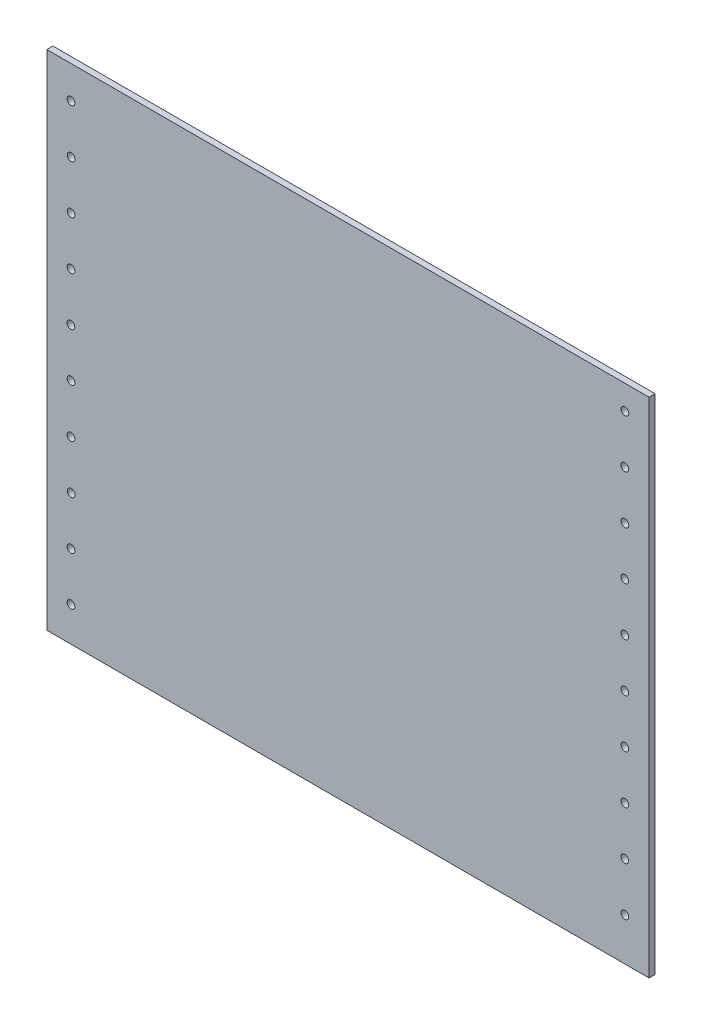
ISO-10303-21;
HEADER;
FILE_DESCRIPTION(('STEP AP214'),'2;1');
FILE_NAME('part.step','',(''),(''),'','','');
FILE_SCHEMA(('AUTOMOTIVE_DESIGN { 1 0 10303 214 1 1 1 1 }'));
ENDSEC;
DATA;
#1=APPLICATION_CONTEXT('core data for automotive mechanical design processes');
#2=APPLICATION_PROTOCOL_DEFINITION('international standard','automotive_design',2000,#1);
#3=PRODUCT_CONTEXT('',#1,'mechanical');
#4=PRODUCT('Part','Part','',(#3));
#5=PRODUCT_RELATED_PRODUCT_CATEGORY('part','',(#4));
#6=PRODUCT_DEFINITION_FORMATION('','',#4);
#7=PRODUCT_DEFINITION_CONTEXT('part definition',#1,'design');
#8=PRODUCT_DEFINITION('design','',#6,#7);
#9=PRODUCT_DEFINITION_SHAPE('','',#8);
#10=(LENGTH_UNIT() NAMED_UNIT(*) SI_UNIT(.MILLI.,.METRE.));
#11=(NAMED_UNIT(*) PLANE_ANGLE_UNIT() SI_UNIT($,.RADIAN.));
#12=(NAMED_UNIT(*) SI_UNIT($,.STERADIAN.) SOLID_ANGLE_UNIT());
#13=UNCERTAINTY_MEASURE_WITH_UNIT(LENGTH_MEASURE(1.E-05),#10,'distance_accuracy_value','');
#14=(GEOMETRIC_REPRESENTATION_CONTEXT(3) GLOBAL_UNCERTAINTY_ASSIGNED_CONTEXT((#13)) GLOBAL_UNIT_ASSIGNED_CONTEXT((#10,
#11,#12)) REPRESENTATION_CONTEXT('',''));
#15=CARTESIAN_POINT('',(0.,0.,0.));
#16=DIRECTION('',(0.,0.,1.));
#17=DIRECTION('',(1.,0.,0.));
#18=AXIS2_PLACEMENT_3D('',#15,#16,#17);
#19=CARTESIAN_POINT('',(0.,0.,3.175));
#20=DIRECTION('',(-1.,0.,0.));
#21=DIRECTION('',(0.,-1.,0.));
#22=AXIS2_PLACEMENT_3D('',#19,#20,#21);
#23=PLANE('',#22);
#24=DIRECTION('',(0.,1.,0.));
#25=VECTOR('',#24,1.);
#26=CARTESIAN_POINT('',(0.,0.,0.));
#27=LINE('',#26,#25);
#28=CARTESIAN_POINT('',(0.,0.,0.));
#29=VERTEX_POINT('',#28);
#30=CARTESIAN_POINT('',(0.,263.652,0.));
#31=VERTEX_POINT('',#30);
#32=EDGE_CURVE('E167',#29,#31,#27,.T.);
#33=ORIENTED_EDGE('',*,*,#32,.T.);
#34=DIRECTION('',(0.,0.,-1.));
#35=VECTOR('',#34,1.);
#36=CARTESIAN_POINT('',(0.,263.652,3.175));
#37=LINE('',#36,#35);
#38=CARTESIAN_POINT('',(0.,263.652,3.175));
#39=VERTEX_POINT('',#38);
#40=EDGE_CURVE('E11',#39,#31,#37,.T.);
#41=ORIENTED_EDGE('',*,*,#40,.F.);
#42=DIRECTION('',(0.,1.,0.));
#43=VECTOR('',#42,1.);
#44=CARTESIAN_POINT('',(0.,0.,3.175));
#45=LINE('',#44,#43);
#46=CARTESIAN_POINT('',(0.,0.,3.175));
#47=VERTEX_POINT('',#46);
#48=EDGE_CURVE('E85',#47,#39,#45,.T.);
#49=ORIENTED_EDGE('',*,*,#48,.F.);
#50=DIRECTION('',(0.,0.,-1.));
#51=VECTOR('',#50,1.);
#52=CARTESIAN_POINT('',(0.,0.,3.175));
#53=LINE('',#52,#51);
#54=EDGE_CURVE('E46',#47,#29,#53,.T.);
#55=ORIENTED_EDGE('',*,*,#54,.T.);
#56=EDGE_LOOP('',(#33,#41,#49,#55));
#57=FACE_BOUND('',#56,.T.);
#58=ADVANCED_FACE('F38',(#57),#23,.F.);
#59=CARTESIAN_POINT('',(0.,263.652,3.175));
#60=DIRECTION('',(0.,-1.,0.));
#61=DIRECTION('',(1.,0.,0.));
#62=AXIS2_PLACEMENT_3D('',#59,#60,#61);
#63=PLANE('',#62);
#64=DIRECTION('',(-1.,0.,0.));
#65=VECTOR('',#64,1.);
#66=CARTESIAN_POINT('',(0.,263.652,0.));
#67=LINE('',#66,#65);
#68=CARTESIAN_POINT('',(-315.722,263.652,0.));
#69=VERTEX_POINT('',#68);
#70=EDGE_CURVE('E66',#31,#69,#67,.T.);
#71=ORIENTED_EDGE('',*,*,#70,.T.);
#72=DIRECTION('',(0.,0.,-1.));
#73=VECTOR('',#72,1.);
#74=CARTESIAN_POINT('',(-315.722,263.652,3.175));
#75=LINE('',#74,#73);
#76=CARTESIAN_POINT('',(-315.722,263.652,3.175));
#77=VERTEX_POINT('',#76);
#78=EDGE_CURVE('E90',#77,#69,#75,.T.);
#79=ORIENTED_EDGE('',*,*,#78,.F.);
#80=DIRECTION('',(-1.,0.,0.));
#81=VECTOR('',#80,1.);
#82=CARTESIAN_POINT('',(0.,263.652,3.175));
#83=LINE('',#82,#81);
#84=EDGE_CURVE('E79',#39,#77,#83,.T.);
#85=ORIENTED_EDGE('',*,*,#84,.F.);
#86=ORIENTED_EDGE('',*,*,#40,.T.);
#87=EDGE_LOOP('',(#71,#79,#85,#86));
#88=FACE_BOUND('',#87,.T.);
#89=ADVANCED_FACE('F91',(#88),#63,.F.);
#90=CARTESIAN_POINT('',(0.,0.,3.175));
#91=DIRECTION('',(0.,1.,0.));
#92=DIRECTION('',(0.,0.,1.));
#93=AXIS2_PLACEMENT_3D('',#90,#91,#92);
#94=PLANE('',#93);
#95=DIRECTION('',(1.,0.,0.));
#96=VECTOR('',#95,1.);
#97=CARTESIAN_POINT('',(0.,0.,0.));
#98=LINE('',#97,#96);
#99=CARTESIAN_POINT('',(-315.722,0.,0.));
#100=VERTEX_POINT('',#99);
#101=EDGE_CURVE('E168',#100,#29,#98,.T.);
#102=ORIENTED_EDGE('',*,*,#101,.T.);
#103=ORIENTED_EDGE('',*,*,#54,.F.);
#104=DIRECTION('',(1.,0.,0.));
#105=VECTOR('',#104,1.);
#106=CARTESIAN_POINT('',(0.,0.,3.175));
#107=LINE('',#106,#105);
#108=CARTESIAN_POINT('',(-315.722,0.,3.175));
#109=VERTEX_POINT('',#108);
#110=EDGE_CURVE('E54',#109,#47,#107,.T.);
#111=ORIENTED_EDGE('',*,*,#110,.F.);
#112=DIRECTION('',(0.,0.,1.));
#113=VECTOR('',#112,1.);
#114=CARTESIAN_POINT('',(-315.722,0.,3.175));
#115=LINE('',#114,#113);
#116=EDGE_CURVE('E97',#100,#109,#115,.T.);
#117=ORIENTED_EDGE('',*,*,#116,.F.);
#118=EDGE_LOOP('',(#102,#103,#111,#117));
#119=FACE_BOUND('',#118,.T.);
#120=ADVANCED_FACE('F177',(#119),#94,.F.);
#121=CARTESIAN_POINT('',(0.,0.,3.175));
#122=DIRECTION('',(0.,0.,1.));
#123=DIRECTION('',(1.,0.,0.));
#124=AXIS2_PLACEMENT_3D('',#121,#122,#123);
#125=PLANE('',#124);
#126=CARTESIAN_POINT('',(-303.038466385573,18.0373055032867,3.175));
#127=DIRECTION('',(0.,0.,1.));
#128=DIRECTION('',(1.,0.,0.));
#129=AXIS2_PLACEMENT_3D('',#126,#127,#128);
#130=CIRCLE('',#129,2.03199999999998);
#131=CARTESIAN_POINT('',(-301.006466385573,18.0373055032867,3.175));
#132=VERTEX_POINT('',#131);
#133=EDGE_CURVE('E491',#132,#132,#130,.T.);
#134=ORIENTED_EDGE('',*,*,#133,.F.);
#135=EDGE_LOOP('',(#134));
#136=FACE_BOUND('',#135,.T.);
#137=CARTESIAN_POINT('',(-303.038466385573,43.3528052156548,3.175));
#138=DIRECTION('',(0.,0.,1.));
#139=DIRECTION('',(1.,0.,0.));
#140=AXIS2_PLACEMENT_3D('',#137,#138,#139);
#141=CIRCLE('',#140,2.03199999999998);
#142=CARTESIAN_POINT('',(-301.006466385573,43.3528052156548,3.175));
#143=VERTEX_POINT('',#142);
#144=EDGE_CURVE('E501',#143,#143,#141,.T.);
#145=ORIENTED_EDGE('',*,*,#144,.F.);
#146=EDGE_LOOP('',(#145));
#147=FACE_BOUND('',#146,.T.);
#148=CARTESIAN_POINT('',(-302.942209732675,68.7645615809216,3.175));
#149=DIRECTION('',(0.,0.,1.));
#150=DIRECTION('',(1.,0.,0.));
#151=AXIS2_PLACEMENT_3D('',#148,#149,#150);
#152=CIRCLE('',#151,2.03199999999998);
#153=CARTESIAN_POINT('',(-300.910209732675,68.7645615809216,3.175));
#154=VERTEX_POINT('',#153);
#155=EDGE_CURVE('E507',#154,#154,#152,.T.);
#156=ORIENTED_EDGE('',*,*,#155,.F.);
#157=EDGE_LOOP('',(#156));
#158=FACE_BOUND('',#157,.T.);
#159=CARTESIAN_POINT('',(-303.05272795072,94.1648563366108,3.175));
#160=DIRECTION('',(0.,0.,1.));
#161=DIRECTION('',(1.,0.,0.));
#162=AXIS2_PLACEMENT_3D('',#159,#160,#161);
#163=CIRCLE('',#162,2.03199999999998);
#164=CARTESIAN_POINT('',(-301.02072795072,94.1648563366108,3.175));
#165=VERTEX_POINT('',#164);
#166=EDGE_CURVE('E513',#165,#165,#163,.T.);
#167=ORIENTED_EDGE('',*,*,#166,.F.);
#168=EDGE_LOOP('',(#167));
#169=FACE_BOUND('',#168,.T.);
#170=CARTESIAN_POINT('',(-303.052670579792,119.665156537544,3.175));
#171=DIRECTION('',(0.,0.,1.));
#172=DIRECTION('',(1.,0.,0.));
#173=AXIS2_PLACEMENT_3D('',#170,#171,#172);
#174=CIRCLE('',#173,2.03199999999998);
#175=CARTESIAN_POINT('',(-301.020670579792,119.665156537544,3.175));
#176=VERTEX_POINT('',#175);
#177=EDGE_CURVE('E519',#176,#176,#174,.T.);
#178=ORIENTED_EDGE('',*,*,#177,.F.);
#179=EDGE_LOOP('',(#178));
#180=FACE_BOUND('',#179,.T.);
#181=CARTESIAN_POINT('',(-303.108229879035,144.967881351292,3.175));
#182=DIRECTION('',(0.,0.,1.));
#183=DIRECTION('',(1.,0.,0.));
#184=AXIS2_PLACEMENT_3D('',#181,#182,#183);
#185=CIRCLE('',#184,2.03199999999998);
#186=CARTESIAN_POINT('',(-301.076229879035,144.967881351292,3.175));
#187=VERTEX_POINT('',#186);
#188=EDGE_CURVE('E525',#187,#187,#185,.T.);
#189=ORIENTED_EDGE('',*,*,#188,.F.);
#190=EDGE_LOOP('',(#189));
#191=FACE_BOUND('',#190,.T.);
#192=CARTESIAN_POINT('',(-303.035806047783,170.388646120707,3.175));
#193=DIRECTION('',(0.,0.,1.));
#194=DIRECTION('',(1.,0.,0.));
#195=AXIS2_PLACEMENT_3D('',#192,#193,#194);
#196=CIRCLE('',#195,2.03199999999998);
#197=CARTESIAN_POINT('',(-301.003806047783,170.388646120707,3.175));
#198=VERTEX_POINT('',#197);
#199=EDGE_CURVE('E531',#198,#198,#196,.T.);
#200=ORIENTED_EDGE('',*,*,#199,.F.);
#201=EDGE_LOOP('',(#200));
#202=FACE_BOUND('',#201,.T.);
#203=CARTESIAN_POINT('',(-302.996197919569,195.793009034226,3.175));
#204=DIRECTION('',(0.,0.,1.));
#205=DIRECTION('',(1.,0.,0.));
#206=AXIS2_PLACEMENT_3D('',#203,#204,#205);
#207=CIRCLE('',#206,2.03199999999998);
#208=CARTESIAN_POINT('',(-300.964197919569,195.793009034226,3.175));
#209=VERTEX_POINT('',#208);
#210=EDGE_CURVE('E537',#209,#209,#207,.T.);
#211=ORIENTED_EDGE('',*,*,#210,.F.);
#212=EDGE_LOOP('',(#211));
#213=FACE_BOUND('',#212,.T.);
#214=CARTESIAN_POINT('',(-302.934584274532,221.174726269806,3.175));
#215=DIRECTION('',(0.,0.,-1.));
#216=DIRECTION('',(-1.,0.,0.));
#217=AXIS2_PLACEMENT_3D('',#214,#215,#216);
#218=CIRCLE('',#217,2.03199999999998);
#219=CARTESIAN_POINT('',(-304.966584274532,221.174726269806,3.175));
#220=VERTEX_POINT('',#219);
#221=EDGE_CURVE('E541',#220,#220,#218,.T.);
#222=ORIENTED_EDGE('',*,*,#221,.T.);
#223=EDGE_LOOP('',(#222));
#224=FACE_BOUND('',#223,.T.);
#225=CARTESIAN_POINT('',(-303.045770192667,246.632047516111,3.175));
#226=DIRECTION('',(0.,0.,-1.));
#227=DIRECTION('',(-1.,0.,0.));
#228=AXIS2_PLACEMENT_3D('',#225,#226,#227);
#229=CIRCLE('',#228,2.03199999999995);
#230=CARTESIAN_POINT('',(-305.077770192667,246.632047516111,3.175));
#231=VERTEX_POINT('',#230);
#232=EDGE_CURVE('E98',#231,#231,#229,.T.);
#233=ORIENTED_EDGE('',*,*,#232,.T.);
#234=EDGE_LOOP('',(#233));
#235=FACE_BOUND('',#234,.T.);
#236=CARTESIAN_POINT('',(-12.7224981537028,22.305646157761,3.175));
#237=DIRECTION('',(0.,0.,-1.));
#238=DIRECTION('',(-1.,0.,0.));
#239=AXIS2_PLACEMENT_3D('',#236,#237,#238);
#240=CIRCLE('',#239,2.032);
#241=CARTESIAN_POINT('',(-14.7544981537028,22.305646157761,3.175));
#242=VERTEX_POINT('',#241);
#243=EDGE_CURVE('E108',#242,#242,#240,.T.);
#244=ORIENTED_EDGE('',*,*,#243,.T.);
#245=EDGE_LOOP('',(#244));
#246=FACE_BOUND('',#245,.T.);
#247=CARTESIAN_POINT('',(-12.7709550150925,47.7319932301895,3.175));
#248=DIRECTION('',(0.,0.,-1.));
#249=DIRECTION('',(-1.,0.,0.));
#250=AXIS2_PLACEMENT_3D('',#247,#248,#249);
#251=CIRCLE('',#250,2.032);
#252=CARTESIAN_POINT('',(-14.8029550150925,47.7319932301895,3.175));
#253=VERTEX_POINT('',#252);
#254=EDGE_CURVE('E114',#253,#253,#251,.T.);
#255=ORIENTED_EDGE('',*,*,#254,.T.);
#256=EDGE_LOOP('',(#255));
#257=FACE_BOUND('',#256,.T.);
#258=CARTESIAN_POINT('',(-12.6985919711104,73.0799787157432,3.175));
#259=DIRECTION('',(0.,0.,-1.));
#260=DIRECTION('',(-1.,0.,0.));
#261=AXIS2_PLACEMENT_3D('',#258,#259,#260);
#262=CIRCLE('',#261,2.032);
#263=CARTESIAN_POINT('',(-14.7305919711104,73.0799787157432,3.175));
#264=VERTEX_POINT('',#263);
#265=EDGE_CURVE('E120',#264,#264,#262,.T.);
#266=ORIENTED_EDGE('',*,*,#265,.T.);
#267=EDGE_LOOP('',(#266));
#268=FACE_BOUND('',#267,.T.);
#269=CARTESIAN_POINT('',(-12.715870449112,98.5406440684166,3.175));
#270=DIRECTION('',(0.,0.,-1.));
#271=DIRECTION('',(-1.,0.,0.));
#272=AXIS2_PLACEMENT_3D('',#269,#270,#271);
#273=CIRCLE('',#272,2.032);
#274=CARTESIAN_POINT('',(-14.747870449112,98.5406440684166,3.175));
#275=VERTEX_POINT('',#274);
#276=EDGE_CURVE('E126',#275,#275,#273,.T.);
#277=ORIENTED_EDGE('',*,*,#276,.T.);
#278=EDGE_LOOP('',(#277));
#279=FACE_BOUND('',#278,.T.);
#280=CARTESIAN_POINT('',(-12.7312605211184,123.951956593345,3.175));
#281=DIRECTION('',(0.,0.,-1.));
#282=DIRECTION('',(-1.,0.,0.));
#283=AXIS2_PLACEMENT_3D('',#280,#281,#282);
#284=CIRCLE('',#283,2.032);
#285=CARTESIAN_POINT('',(-14.7632605211184,123.951956593345,3.175));
#286=VERTEX_POINT('',#285);
#287=EDGE_CURVE('E132',#286,#286,#284,.T.);
#288=ORIENTED_EDGE('',*,*,#287,.T.);
#289=EDGE_LOOP('',(#288));
#290=FACE_BOUND('',#289,.T.);
#291=CARTESIAN_POINT('',(-12.7060036534914,149.340547347492,3.175));
#292=DIRECTION('',(0.,0.,-1.));
#293=DIRECTION('',(-1.,0.,0.));
#294=AXIS2_PLACEMENT_3D('',#291,#292,#293);
#295=CIRCLE('',#294,2.032);
#296=CARTESIAN_POINT('',(-14.7380036534914,149.340547347492,3.175));
#297=VERTEX_POINT('',#296);
#298=EDGE_CURVE('E138',#297,#297,#295,.T.);
#299=ORIENTED_EDGE('',*,*,#298,.T.);
#300=EDGE_LOOP('',(#299));
#301=FACE_BOUND('',#300,.T.);
#302=CARTESIAN_POINT('',(-12.7383117328772,174.751351443042,3.175));
#303=DIRECTION('',(0.,0.,-1.));
#304=DIRECTION('',(-1.,0.,0.));
#305=AXIS2_PLACEMENT_3D('',#302,#303,#304);
#306=CIRCLE('',#305,2.032);
#307=CARTESIAN_POINT('',(-14.7703117328772,174.751351443042,3.175));
#308=VERTEX_POINT('',#307);
#309=EDGE_CURVE('E144',#308,#308,#306,.T.);
#310=ORIENTED_EDGE('',*,*,#309,.T.);
#311=EDGE_LOOP('',(#310));
#312=FACE_BOUND('',#311,.T.);
#313=CARTESIAN_POINT('',(-12.6975027770239,200.153488855026,3.175));
#314=DIRECTION('',(0.,0.,-1.));
#315=DIRECTION('',(-1.,0.,0.));
#316=AXIS2_PLACEMENT_3D('',#313,#314,#315);
#317=CIRCLE('',#316,2.032);
#318=CARTESIAN_POINT('',(-14.7295027770239,200.153488855026,3.175));
#319=VERTEX_POINT('',#318);
#320=EDGE_CURVE('E150',#319,#319,#317,.T.);
#321=ORIENTED_EDGE('',*,*,#320,.T.);
#322=EDGE_LOOP('',(#321));
#323=FACE_BOUND('',#322,.T.);
#324=CARTESIAN_POINT('',(-12.748360271577,225.521736015788,3.175));
#325=DIRECTION('',(0.,0.,-1.));
#326=DIRECTION('',(-1.,0.,0.));
#327=AXIS2_PLACEMENT_3D('',#324,#325,#326);
#328=CIRCLE('',#327,2.032);
#329=CARTESIAN_POINT('',(-14.780360271577,225.521736015788,3.175));
#330=VERTEX_POINT('',#329);
#331=EDGE_CURVE('E156',#330,#330,#328,.T.);
#332=ORIENTED_EDGE('',*,*,#331,.T.);
#333=EDGE_LOOP('',(#332));
#334=FACE_BOUND('',#333,.T.);
#335=CARTESIAN_POINT('',(-12.7,250.952,3.175));
#336=DIRECTION('',(0.,0.,1.));
#337=DIRECTION('',(1.,0.,0.));
#338=AXIS2_PLACEMENT_3D('',#335,#336,#337);
#339=CIRCLE('',#338,2.03200000000001);
#340=CARTESIAN_POINT('',(-10.668,250.952,3.175));
#341=VERTEX_POINT('',#340);
#342=EDGE_CURVE('E159',#341,#341,#339,.T.);
#343=ORIENTED_EDGE('',*,*,#342,.F.);
#344=EDGE_LOOP('',(#343));
#345=FACE_BOUND('',#344,.T.);
#346=ORIENTED_EDGE('',*,*,#48,.T.);
#347=ORIENTED_EDGE('',*,*,#84,.T.);
#348=DIRECTION('',(0.,1.,0.));
#349=VECTOR('',#348,1.);
#350=CARTESIAN_POINT('',(-315.722,0.,3.175));
#351=LINE('',#350,#349);
#352=EDGE_CURVE('E83',#109,#77,#351,.T.);
#353=ORIENTED_EDGE('',*,*,#352,.F.);
#354=ORIENTED_EDGE('',*,*,#110,.T.);
#355=EDGE_LOOP('',(#346,#347,#353,#354));
#356=FACE_BOUND('',#355,.T.);
#357=ADVANCED_FACE('F81',(#136,#147,#158,#169,#180,#191,#202,#213,#224,#235,#246,#257,#268,#279,
#290,#301,#312,#323,#334,#345,#356),#125,.T.);
#358=CARTESIAN_POINT('',(0.,0.,0.));
#359=DIRECTION('',(0.,0.,1.));
#360=DIRECTION('',(1.,0.,0.));
#361=AXIS2_PLACEMENT_3D('',#358,#359,#360);
#362=PLANE('',#361);
#363=CARTESIAN_POINT('',(-303.038466385573,18.0373055032867,0.));
#364=DIRECTION('',(0.,0.,-1.));
#365=DIRECTION('',(-1.,0.,0.));
#366=AXIS2_PLACEMENT_3D('',#363,#364,#365);
#367=CIRCLE('',#366,2.03199999999998);
#368=CARTESIAN_POINT('',(-305.070466385573,18.0373055032867,0.));
#369=VERTEX_POINT('',#368);
#370=EDGE_CURVE('E494',#369,#369,#367,.T.);
#371=ORIENTED_EDGE('',*,*,#370,.F.);
#372=EDGE_LOOP('',(#371));
#373=FACE_BOUND('',#372,.T.);
#374=CARTESIAN_POINT('',(-303.038466385573,43.3528052156548,0.));
#375=DIRECTION('',(0.,0.,-1.));
#376=DIRECTION('',(-1.,0.,0.));
#377=AXIS2_PLACEMENT_3D('',#374,#375,#376);
#378=CIRCLE('',#377,2.03199999999998);
#379=CARTESIAN_POINT('',(-305.070466385573,43.3528052156548,0.));
#380=VERTEX_POINT('',#379);
#381=EDGE_CURVE('E496',#380,#380,#378,.T.);
#382=ORIENTED_EDGE('',*,*,#381,.F.);
#383=EDGE_LOOP('',(#382));
#384=FACE_BOUND('',#383,.T.);
#385=CARTESIAN_POINT('',(-302.942209732675,68.7645615809216,0.));
#386=DIRECTION('',(0.,0.,-1.));
#387=DIRECTION('',(-1.,0.,0.));
#388=AXIS2_PLACEMENT_3D('',#385,#386,#387);
#389=CIRCLE('',#388,2.03199999999998);
#390=CARTESIAN_POINT('',(-304.974209732675,68.7645615809216,0.));
#391=VERTEX_POINT('',#390);
#392=EDGE_CURVE('E504',#391,#391,#389,.T.);
#393=ORIENTED_EDGE('',*,*,#392,.F.);
#394=EDGE_LOOP('',(#393));
#395=FACE_BOUND('',#394,.T.);
#396=CARTESIAN_POINT('',(-303.05272795072,94.1648563366108,0.));
#397=DIRECTION('',(0.,0.,-1.));
#398=DIRECTION('',(-1.,0.,0.));
#399=AXIS2_PLACEMENT_3D('',#396,#397,#398);
#400=CIRCLE('',#399,2.03199999999998);
#401=CARTESIAN_POINT('',(-305.08472795072,94.1648563366108,0.));
#402=VERTEX_POINT('',#401);
#403=EDGE_CURVE('E510',#402,#402,#400,.T.);
#404=ORIENTED_EDGE('',*,*,#403,.F.);
#405=EDGE_LOOP('',(#404));
#406=FACE_BOUND('',#405,.T.);
#407=CARTESIAN_POINT('',(-303.052670579792,119.665156537544,0.));
#408=DIRECTION('',(0.,0.,-1.));
#409=DIRECTION('',(-1.,0.,0.));
#410=AXIS2_PLACEMENT_3D('',#407,#408,#409);
#411=CIRCLE('',#410,2.03199999999998);
#412=CARTESIAN_POINT('',(-305.084670579792,119.665156537544,0.));
#413=VERTEX_POINT('',#412);
#414=EDGE_CURVE('E516',#413,#413,#411,.T.);
#415=ORIENTED_EDGE('',*,*,#414,.F.);
#416=EDGE_LOOP('',(#415));
#417=FACE_BOUND('',#416,.T.);
#418=CARTESIAN_POINT('',(-303.108229879035,144.967881351292,0.));
#419=DIRECTION('',(0.,0.,-1.));
#420=DIRECTION('',(-1.,0.,0.));
#421=AXIS2_PLACEMENT_3D('',#418,#419,#420);
#422=CIRCLE('',#421,2.03199999999998);
#423=CARTESIAN_POINT('',(-305.140229879035,144.967881351292,0.));
#424=VERTEX_POINT('',#423);
#425=EDGE_CURVE('E522',#424,#424,#422,.T.);
#426=ORIENTED_EDGE('',*,*,#425,.F.);
#427=EDGE_LOOP('',(#426));
#428=FACE_BOUND('',#427,.T.);
#429=CARTESIAN_POINT('',(-303.035806047783,170.388646120707,0.));
#430=DIRECTION('',(0.,0.,-1.));
#431=DIRECTION('',(-1.,0.,0.));
#432=AXIS2_PLACEMENT_3D('',#429,#430,#431);
#433=CIRCLE('',#432,2.03199999999998);
#434=CARTESIAN_POINT('',(-305.067806047783,170.388646120707,0.));
#435=VERTEX_POINT('',#434);
#436=EDGE_CURVE('E528',#435,#435,#433,.T.);
#437=ORIENTED_EDGE('',*,*,#436,.F.);
#438=EDGE_LOOP('',(#437));
#439=FACE_BOUND('',#438,.T.);
#440=CARTESIAN_POINT('',(-302.996197919569,195.793009034226,0.));
#441=DIRECTION('',(0.,0.,-1.));
#442=DIRECTION('',(-1.,0.,0.));
#443=AXIS2_PLACEMENT_3D('',#440,#441,#442);
#444=CIRCLE('',#443,2.03199999999998);
#445=CARTESIAN_POINT('',(-305.028197919569,195.793009034226,0.));
#446=VERTEX_POINT('',#445);
#447=EDGE_CURVE('E534',#446,#446,#444,.T.);
#448=ORIENTED_EDGE('',*,*,#447,.F.);
#449=EDGE_LOOP('',(#448));
#450=FACE_BOUND('',#449,.T.);
#451=CARTESIAN_POINT('',(-302.934584274532,221.174726269806,0.));
#452=DIRECTION('',(0.,0.,-1.));
#453=DIRECTION('',(-1.,0.,0.));
#454=AXIS2_PLACEMENT_3D('',#451,#452,#453);
#455=CIRCLE('',#454,2.03199999999998);
#456=CARTESIAN_POINT('',(-304.966584274532,221.174726269806,0.));
#457=VERTEX_POINT('',#456);
#458=EDGE_CURVE('E540',#457,#457,#455,.T.);
#459=ORIENTED_EDGE('',*,*,#458,.F.);
#460=EDGE_LOOP('',(#459));
#461=FACE_BOUND('',#460,.T.);
#462=CARTESIAN_POINT('',(-303.045770192667,246.632047516111,0.));
#463=DIRECTION('',(0.,0.,-1.));
#464=DIRECTION('',(-1.,0.,0.));
#465=AXIS2_PLACEMENT_3D('',#462,#463,#464);
#466=CIRCLE('',#465,2.03199999999995);
#467=CARTESIAN_POINT('',(-305.077770192667,246.632047516111,0.));
#468=VERTEX_POINT('',#467);
#469=EDGE_CURVE('E101',#468,#468,#466,.T.);
#470=ORIENTED_EDGE('',*,*,#469,.F.);
#471=EDGE_LOOP('',(#470));
#472=FACE_BOUND('',#471,.T.);
#473=CARTESIAN_POINT('',(-12.7224981537028,22.305646157761,0.));
#474=DIRECTION('',(0.,0.,-1.));
#475=DIRECTION('',(-1.,0.,0.));
#476=AXIS2_PLACEMENT_3D('',#473,#474,#475);
#477=CIRCLE('',#476,2.032);
#478=CARTESIAN_POINT('',(-14.7544981537028,22.305646157761,0.));
#479=VERTEX_POINT('',#478);
#480=EDGE_CURVE('E107',#479,#479,#477,.T.);
#481=ORIENTED_EDGE('',*,*,#480,.F.);
#482=EDGE_LOOP('',(#481));
#483=FACE_BOUND('',#482,.T.);
#484=CARTESIAN_POINT('',(-12.7709550150925,47.7319932301895,0.));
#485=DIRECTION('',(0.,0.,-1.));
#486=DIRECTION('',(-1.,0.,0.));
#487=AXIS2_PLACEMENT_3D('',#484,#485,#486);
#488=CIRCLE('',#487,2.032);
#489=CARTESIAN_POINT('',(-14.8029550150925,47.7319932301895,0.));
#490=VERTEX_POINT('',#489);
#491=EDGE_CURVE('E111',#490,#490,#488,.T.);
#492=ORIENTED_EDGE('',*,*,#491,.F.);
#493=EDGE_LOOP('',(#492));
#494=FACE_BOUND('',#493,.T.);
#495=CARTESIAN_POINT('',(-12.6985919711104,73.0799787157432,0.));
#496=DIRECTION('',(0.,0.,-1.));
#497=DIRECTION('',(-1.,0.,0.));
#498=AXIS2_PLACEMENT_3D('',#495,#496,#497);
#499=CIRCLE('',#498,2.032);
#500=CARTESIAN_POINT('',(-14.7305919711104,73.0799787157432,0.));
#501=VERTEX_POINT('',#500);
#502=EDGE_CURVE('E117',#501,#501,#499,.T.);
#503=ORIENTED_EDGE('',*,*,#502,.F.);
#504=EDGE_LOOP('',(#503));
#505=FACE_BOUND('',#504,.T.);
#506=CARTESIAN_POINT('',(-12.715870449112,98.5406440684166,0.));
#507=DIRECTION('',(0.,0.,-1.));
#508=DIRECTION('',(-1.,0.,0.));
#509=AXIS2_PLACEMENT_3D('',#506,#507,#508);
#510=CIRCLE('',#509,2.032);
#511=CARTESIAN_POINT('',(-14.747870449112,98.5406440684166,0.));
#512=VERTEX_POINT('',#511);
#513=EDGE_CURVE('E123',#512,#512,#510,.T.);
#514=ORIENTED_EDGE('',*,*,#513,.F.);
#515=EDGE_LOOP('',(#514));
#516=FACE_BOUND('',#515,.T.);
#517=CARTESIAN_POINT('',(-12.7312605211184,123.951956593345,0.));
#518=DIRECTION('',(0.,0.,-1.));
#519=DIRECTION('',(-1.,0.,0.));
#520=AXIS2_PLACEMENT_3D('',#517,#518,#519);
#521=CIRCLE('',#520,2.032);
#522=CARTESIAN_POINT('',(-14.7632605211184,123.951956593345,0.));
#523=VERTEX_POINT('',#522);
#524=EDGE_CURVE('E129',#523,#523,#521,.T.);
#525=ORIENTED_EDGE('',*,*,#524,.F.);
#526=EDGE_LOOP('',(#525));
#527=FACE_BOUND('',#526,.T.);
#528=CARTESIAN_POINT('',(-12.7060036534914,149.340547347492,0.));
#529=DIRECTION('',(0.,0.,-1.));
#530=DIRECTION('',(-1.,0.,0.));
#531=AXIS2_PLACEMENT_3D('',#528,#529,#530);
#532=CIRCLE('',#531,2.032);
#533=CARTESIAN_POINT('',(-14.7380036534914,149.340547347492,0.));
#534=VERTEX_POINT('',#533);
#535=EDGE_CURVE('E135',#534,#534,#532,.T.);
#536=ORIENTED_EDGE('',*,*,#535,.F.);
#537=EDGE_LOOP('',(#536));
#538=FACE_BOUND('',#537,.T.);
#539=CARTESIAN_POINT('',(-12.7383117328772,174.751351443042,0.));
#540=DIRECTION('',(0.,0.,-1.));
#541=DIRECTION('',(-1.,0.,0.));
#542=AXIS2_PLACEMENT_3D('',#539,#540,#541);
#543=CIRCLE('',#542,2.032);
#544=CARTESIAN_POINT('',(-14.7703117328772,174.751351443042,0.));
#545=VERTEX_POINT('',#544);
#546=EDGE_CURVE('E141',#545,#545,#543,.T.);
#547=ORIENTED_EDGE('',*,*,#546,.F.);
#548=EDGE_LOOP('',(#547));
#549=FACE_BOUND('',#548,.T.);
#550=CARTESIAN_POINT('',(-12.6975027770239,200.153488855026,0.));
#551=DIRECTION('',(0.,0.,-1.));
#552=DIRECTION('',(-1.,0.,0.));
#553=AXIS2_PLACEMENT_3D('',#550,#551,#552);
#554=CIRCLE('',#553,2.032);
#555=CARTESIAN_POINT('',(-14.7295027770239,200.153488855026,0.));
#556=VERTEX_POINT('',#555);
#557=EDGE_CURVE('E147',#556,#556,#554,.T.);
#558=ORIENTED_EDGE('',*,*,#557,.F.);
#559=EDGE_LOOP('',(#558));
#560=FACE_BOUND('',#559,.T.);
#561=CARTESIAN_POINT('',(-12.748360271577,225.521736015788,0.));
#562=DIRECTION('',(0.,0.,-1.));
#563=DIRECTION('',(-1.,0.,0.));
#564=AXIS2_PLACEMENT_3D('',#561,#562,#563);
#565=CIRCLE('',#564,2.032);
#566=CARTESIAN_POINT('',(-14.780360271577,225.521736015788,0.));
#567=VERTEX_POINT('',#566);
#568=EDGE_CURVE('E153',#567,#567,#565,.T.);
#569=ORIENTED_EDGE('',*,*,#568,.F.);
#570=EDGE_LOOP('',(#569));
#571=FACE_BOUND('',#570,.T.);
#572=CARTESIAN_POINT('',(-12.7,250.952,0.));
#573=DIRECTION('',(0.,0.,1.));
#574=DIRECTION('',(1.,0.,0.));
#575=AXIS2_PLACEMENT_3D('',#572,#573,#574);
#576=CIRCLE('',#575,2.03200000000001);
#577=CARTESIAN_POINT('',(-10.668,250.952,0.));
#578=VERTEX_POINT('',#577);
#579=EDGE_CURVE('E164',#578,#578,#576,.F.);
#580=ORIENTED_EDGE('',*,*,#579,.F.);
#581=EDGE_LOOP('',(#580));
#582=FACE_BOUND('',#581,.T.);
#583=ORIENTED_EDGE('',*,*,#32,.F.);
#584=ORIENTED_EDGE('',*,*,#101,.F.);
#585=DIRECTION('',(0.,-1.,0.));
#586=VECTOR('',#585,1.);
#587=CARTESIAN_POINT('',(-315.722,0.,0.));
#588=LINE('',#587,#586);
#589=EDGE_CURVE('E94',#69,#100,#588,.T.);
#590=ORIENTED_EDGE('',*,*,#589,.F.);
#591=ORIENTED_EDGE('',*,*,#70,.F.);
#592=EDGE_LOOP('',(#583,#584,#590,#591));
#593=FACE_BOUND('',#592,.T.);
#594=ADVANCED_FACE('F176',(#373,#384,#395,#406,#417,#428,#439,#450,#461,#472,#483,#494,#505,
#516,#527,#538,#549,#560,#571,#582,#593),#362,.F.);
#595=CARTESIAN_POINT('',(-12.7,250.952,-5.74736391748431));
#596=DIRECTION('',(0.,0.,1.));
#597=DIRECTION('',(1.,0.,0.));
#598=AXIS2_PLACEMENT_3D('',#595,#596,#597);
#599=CYLINDRICAL_SURFACE('',#598,2.03200000000001);
#600=ORIENTED_EDGE('',*,*,#579,.T.);
#601=EDGE_LOOP('',(#600));
#602=FACE_BOUND('',#601,.T.);
#603=ORIENTED_EDGE('',*,*,#342,.T.);
#604=EDGE_LOOP('',(#603));
#605=FACE_BOUND('',#604,.T.);
#606=ADVANCED_FACE('F324',(#602,#605),#599,.F.);
#607=CARTESIAN_POINT('',(-12.748360271577,225.521736015788,3.175));
#608=DIRECTION('',(0.,0.,-1.));
#609=DIRECTION('',(-1.,0.,0.));
#610=AXIS2_PLACEMENT_3D('',#607,#608,#609);
#611=CYLINDRICAL_SURFACE('',#610,2.032);
#612=ORIENTED_EDGE('',*,*,#331,.F.);
#613=EDGE_LOOP('',(#612));
#614=FACE_BOUND('',#613,.T.);
#615=ORIENTED_EDGE('',*,*,#568,.T.);
#616=EDGE_LOOP('',(#615));
#617=FACE_BOUND('',#616,.T.);
#618=ADVANCED_FACE('F369',(#614,#617),#611,.F.);
#619=CARTESIAN_POINT('',(-12.6975027770239,200.153488855026,3.175));
#620=DIRECTION('',(0.,0.,-1.));
#621=DIRECTION('',(-1.,0.,0.));
#622=AXIS2_PLACEMENT_3D('',#619,#620,#621);
#623=CYLINDRICAL_SURFACE('',#622,2.032);
#624=ORIENTED_EDGE('',*,*,#320,.F.);
#625=EDGE_LOOP('',(#624));
#626=FACE_BOUND('',#625,.T.);
#627=ORIENTED_EDGE('',*,*,#557,.T.);
#628=EDGE_LOOP('',(#627));
#629=FACE_BOUND('',#628,.T.);
#630=ADVANCED_FACE('F365',(#626,#629),#623,.F.);
#631=CARTESIAN_POINT('',(-12.7383117328772,174.751351443042,3.175));
#632=DIRECTION('',(0.,0.,-1.));
#633=DIRECTION('',(-1.,0.,0.));
#634=AXIS2_PLACEMENT_3D('',#631,#632,#633);
#635=CYLINDRICAL_SURFACE('',#634,2.032);
#636=ORIENTED_EDGE('',*,*,#309,.F.);
#637=EDGE_LOOP('',(#636));
#638=FACE_BOUND('',#637,.T.);
#639=ORIENTED_EDGE('',*,*,#546,.T.);
#640=EDGE_LOOP('',(#639));
#641=FACE_BOUND('',#640,.T.);
#642=ADVANCED_FACE('F361',(#638,#641),#635,.F.);
#643=CARTESIAN_POINT('',(-12.7060036534914,149.340547347492,3.175));
#644=DIRECTION('',(0.,0.,-1.));
#645=DIRECTION('',(-1.,0.,0.));
#646=AXIS2_PLACEMENT_3D('',#643,#644,#645);
#647=CYLINDRICAL_SURFACE('',#646,2.032);
#648=ORIENTED_EDGE('',*,*,#298,.F.);
#649=EDGE_LOOP('',(#648));
#650=FACE_BOUND('',#649,.T.);
#651=ORIENTED_EDGE('',*,*,#535,.T.);
#652=EDGE_LOOP('',(#651));
#653=FACE_BOUND('',#652,.T.);
#654=ADVANCED_FACE('F357',(#650,#653),#647,.F.);
#655=CARTESIAN_POINT('',(-12.7312605211184,123.951956593345,3.175));
#656=DIRECTION('',(0.,0.,-1.));
#657=DIRECTION('',(-1.,0.,0.));
#658=AXIS2_PLACEMENT_3D('',#655,#656,#657);
#659=CYLINDRICAL_SURFACE('',#658,2.032);
#660=ORIENTED_EDGE('',*,*,#287,.F.);
#661=EDGE_LOOP('',(#660));
#662=FACE_BOUND('',#661,.T.);
#663=ORIENTED_EDGE('',*,*,#524,.T.);
#664=EDGE_LOOP('',(#663));
#665=FACE_BOUND('',#664,.T.);
#666=ADVANCED_FACE('F353',(#662,#665),#659,.F.);
#667=CARTESIAN_POINT('',(-12.715870449112,98.5406440684166,3.175));
#668=DIRECTION('',(0.,0.,-1.));
#669=DIRECTION('',(-1.,0.,0.));
#670=AXIS2_PLACEMENT_3D('',#667,#668,#669);
#671=CYLINDRICAL_SURFACE('',#670,2.032);
#672=ORIENTED_EDGE('',*,*,#276,.F.);
#673=EDGE_LOOP('',(#672));
#674=FACE_BOUND('',#673,.T.);
#675=ORIENTED_EDGE('',*,*,#513,.T.);
#676=EDGE_LOOP('',(#675));
#677=FACE_BOUND('',#676,.T.);
#678=ADVANCED_FACE('F349',(#674,#677),#671,.F.);
#679=CARTESIAN_POINT('',(-12.6985919711104,73.0799787157432,3.175));
#680=DIRECTION('',(0.,0.,-1.));
#681=DIRECTION('',(-1.,0.,0.));
#682=AXIS2_PLACEMENT_3D('',#679,#680,#681);
#683=CYLINDRICAL_SURFACE('',#682,2.032);
#684=ORIENTED_EDGE('',*,*,#265,.F.);
#685=EDGE_LOOP('',(#684));
#686=FACE_BOUND('',#685,.T.);
#687=ORIENTED_EDGE('',*,*,#502,.T.);
#688=EDGE_LOOP('',(#687));
#689=FACE_BOUND('',#688,.T.);
#690=ADVANCED_FACE('F345',(#686,#689),#683,.F.);
#691=CARTESIAN_POINT('',(-12.7709550150925,47.7319932301895,3.175));
#692=DIRECTION('',(0.,0.,-1.));
#693=DIRECTION('',(-1.,0.,0.));
#694=AXIS2_PLACEMENT_3D('',#691,#692,#693);
#695=CYLINDRICAL_SURFACE('',#694,2.032);
#696=ORIENTED_EDGE('',*,*,#254,.F.);
#697=EDGE_LOOP('',(#696));
#698=FACE_BOUND('',#697,.T.);
#699=ORIENTED_EDGE('',*,*,#491,.T.);
#700=EDGE_LOOP('',(#699));
#701=FACE_BOUND('',#700,.T.);
#702=ADVANCED_FACE('F341',(#698,#701),#695,.F.);
#703=CARTESIAN_POINT('',(-12.7224981537028,22.305646157761,3.175));
#704=DIRECTION('',(0.,0.,-1.));
#705=DIRECTION('',(-1.,0.,0.));
#706=AXIS2_PLACEMENT_3D('',#703,#704,#705);
#707=CYLINDRICAL_SURFACE('',#706,2.032);
#708=ORIENTED_EDGE('',*,*,#243,.F.);
#709=EDGE_LOOP('',(#708));
#710=FACE_BOUND('',#709,.T.);
#711=ORIENTED_EDGE('',*,*,#480,.T.);
#712=EDGE_LOOP('',(#711));
#713=FACE_BOUND('',#712,.T.);
#714=ADVANCED_FACE('F203',(#710,#713),#707,.F.);
#715=CARTESIAN_POINT('',(-315.722,0.,0.));
#716=DIRECTION('',(-1.,0.,0.));
#717=DIRECTION('',(0.,0.,1.));
#718=AXIS2_PLACEMENT_3D('',#715,#716,#717);
#719=PLANE('',#718);
#720=ORIENTED_EDGE('',*,*,#352,.T.);
#721=ORIENTED_EDGE('',*,*,#78,.T.);
#722=ORIENTED_EDGE('',*,*,#589,.T.);
#723=ORIENTED_EDGE('',*,*,#116,.T.);
#724=EDGE_LOOP('',(#720,#721,#722,#723));
#725=FACE_BOUND('',#724,.T.);
#726=ADVANCED_FACE('F96',(#725),#719,.T.);
#727=CARTESIAN_POINT('',(-303.045770192667,246.632047516111,3.175));
#728=DIRECTION('',(0.,0.,-1.));
#729=DIRECTION('',(-1.,0.,0.));
#730=AXIS2_PLACEMENT_3D('',#727,#728,#729);
#731=CYLINDRICAL_SURFACE('',#730,2.03199999999995);
#732=ORIENTED_EDGE('',*,*,#232,.F.);
#733=EDGE_LOOP('',(#732));
#734=FACE_BOUND('',#733,.T.);
#735=ORIENTED_EDGE('',*,*,#469,.T.);
#736=EDGE_LOOP('',(#735));
#737=FACE_BOUND('',#736,.T.);
#738=ADVANCED_FACE('F217',(#734,#737),#731,.F.);
#739=CARTESIAN_POINT('',(-302.934584274532,221.174726269806,3.175));
#740=DIRECTION('',(0.,0.,-1.));
#741=DIRECTION('',(-1.,0.,0.));
#742=AXIS2_PLACEMENT_3D('',#739,#740,#741);
#743=CYLINDRICAL_SURFACE('',#742,2.03199999999998);
#744=ORIENTED_EDGE('',*,*,#221,.F.);
#745=EDGE_LOOP('',(#744));
#746=FACE_BOUND('',#745,.T.);
#747=ORIENTED_EDGE('',*,*,#458,.T.);
#748=EDGE_LOOP('',(#747));
#749=FACE_BOUND('',#748,.T.);
#750=ADVANCED_FACE('F227',(#746,#749),#743,.F.);
#751=CARTESIAN_POINT('',(-302.996197919569,195.793009034226,4.064));
#752=DIRECTION('',(0.,0.,-1.));
#753=DIRECTION('',(-1.,0.,0.));
#754=AXIS2_PLACEMENT_3D('',#751,#752,#753);
#755=CYLINDRICAL_SURFACE('',#754,2.03199999999998);
#756=ORIENTED_EDGE('',*,*,#210,.T.);
#757=EDGE_LOOP('',(#756));
#758=FACE_BOUND('',#757,.T.);
#759=ORIENTED_EDGE('',*,*,#447,.T.);
#760=EDGE_LOOP('',(#759));
#761=FACE_BOUND('',#760,.T.);
#762=ADVANCED_FACE('F237',(#758,#761),#755,.F.);
#763=CARTESIAN_POINT('',(-303.035806047783,170.388646120707,4.064));
#764=DIRECTION('',(0.,0.,-1.));
#765=DIRECTION('',(-1.,0.,0.));
#766=AXIS2_PLACEMENT_3D('',#763,#764,#765);
#767=CYLINDRICAL_SURFACE('',#766,2.03199999999998);
#768=ORIENTED_EDGE('',*,*,#199,.T.);
#769=EDGE_LOOP('',(#768));
#770=FACE_BOUND('',#769,.T.);
#771=ORIENTED_EDGE('',*,*,#436,.T.);
#772=EDGE_LOOP('',(#771));
#773=FACE_BOUND('',#772,.T.);
#774=ADVANCED_FACE('F247',(#770,#773),#767,.F.);
#775=CARTESIAN_POINT('',(-303.108229879035,144.967881351292,4.064));
#776=DIRECTION('',(0.,0.,-1.));
#777=DIRECTION('',(-1.,0.,0.));
#778=AXIS2_PLACEMENT_3D('',#775,#776,#777);
#779=CYLINDRICAL_SURFACE('',#778,2.03199999999998);
#780=ORIENTED_EDGE('',*,*,#188,.T.);
#781=EDGE_LOOP('',(#780));
#782=FACE_BOUND('',#781,.T.);
#783=ORIENTED_EDGE('',*,*,#425,.T.);
#784=EDGE_LOOP('',(#783));
#785=FACE_BOUND('',#784,.T.);
#786=ADVANCED_FACE('F257',(#782,#785),#779,.F.);
#787=CARTESIAN_POINT('',(-303.052670579792,119.665156537544,4.064));
#788=DIRECTION('',(0.,0.,-1.));
#789=DIRECTION('',(-1.,0.,0.));
#790=AXIS2_PLACEMENT_3D('',#787,#788,#789);
#791=CYLINDRICAL_SURFACE('',#790,2.03199999999998);
#792=ORIENTED_EDGE('',*,*,#177,.T.);
#793=EDGE_LOOP('',(#792));
#794=FACE_BOUND('',#793,.T.);
#795=ORIENTED_EDGE('',*,*,#414,.T.);
#796=EDGE_LOOP('',(#795));
#797=FACE_BOUND('',#796,.T.);
#798=ADVANCED_FACE('F267',(#794,#797),#791,.F.);
#799=CARTESIAN_POINT('',(-303.05272795072,94.1648563366108,4.064));
#800=DIRECTION('',(0.,0.,-1.));
#801=DIRECTION('',(-1.,0.,0.));
#802=AXIS2_PLACEMENT_3D('',#799,#800,#801);
#803=CYLINDRICAL_SURFACE('',#802,2.03199999999998);
#804=ORIENTED_EDGE('',*,*,#166,.T.);
#805=EDGE_LOOP('',(#804));
#806=FACE_BOUND('',#805,.T.);
#807=ORIENTED_EDGE('',*,*,#403,.T.);
#808=EDGE_LOOP('',(#807));
#809=FACE_BOUND('',#808,.T.);
#810=ADVANCED_FACE('F277',(#806,#809),#803,.F.);
#811=CARTESIAN_POINT('',(-302.942209732675,68.7645615809216,4.064));
#812=DIRECTION('',(0.,0.,-1.));
#813=DIRECTION('',(-1.,0.,0.));
#814=AXIS2_PLACEMENT_3D('',#811,#812,#813);
#815=CYLINDRICAL_SURFACE('',#814,2.03199999999998);
#816=ORIENTED_EDGE('',*,*,#155,.T.);
#817=EDGE_LOOP('',(#816));
#818=FACE_BOUND('',#817,.T.);
#819=ORIENTED_EDGE('',*,*,#392,.T.);
#820=EDGE_LOOP('',(#819));
#821=FACE_BOUND('',#820,.T.);
#822=ADVANCED_FACE('F287',(#818,#821),#815,.F.);
#823=CARTESIAN_POINT('',(-303.038466385573,43.3528052156548,4.064));
#824=DIRECTION('',(0.,0.,-1.));
#825=DIRECTION('',(-1.,0.,0.));
#826=AXIS2_PLACEMENT_3D('',#823,#824,#825);
#827=CYLINDRICAL_SURFACE('',#826,2.03199999999998);
#828=ORIENTED_EDGE('',*,*,#144,.T.);
#829=EDGE_LOOP('',(#828));
#830=FACE_BOUND('',#829,.T.);
#831=ORIENTED_EDGE('',*,*,#381,.T.);
#832=EDGE_LOOP('',(#831));
#833=FACE_BOUND('',#832,.T.);
#834=ADVANCED_FACE('F297',(#830,#833),#827,.F.);
#835=CARTESIAN_POINT('',(-303.038466385573,18.0373055032867,4.064));
#836=DIRECTION('',(0.,0.,-1.));
#837=DIRECTION('',(-1.,0.,0.));
#838=AXIS2_PLACEMENT_3D('',#835,#836,#837);
#839=CYLINDRICAL_SURFACE('',#838,2.03199999999998);
#840=ORIENTED_EDGE('',*,*,#133,.T.);
#841=EDGE_LOOP('',(#840));
#842=FACE_BOUND('',#841,.T.);
#843=ORIENTED_EDGE('',*,*,#370,.T.);
#844=EDGE_LOOP('',(#843));
#845=FACE_BOUND('',#844,.T.);
#846=ADVANCED_FACE('F307',(#842,#845),#839,.F.);
#847=CLOSED_SHELL('',(#58,#89,#120,#357,#594,#606,#618,#630,#642,#654,#666,#678,#690,#702,#714,
#726,#738,#750,#762,#774,#786,#798,#810,#822,#834,#846));
#848=MANIFOLD_SOLID_BREP('B2',#847);
#849=ADVANCED_BREP_SHAPE_REPRESENTATION('',(#18,#848),#14);
#850=SHAPE_DEFINITION_REPRESENTATION(#9,#849);
ENDSEC;
END-ISO-10303-21;
